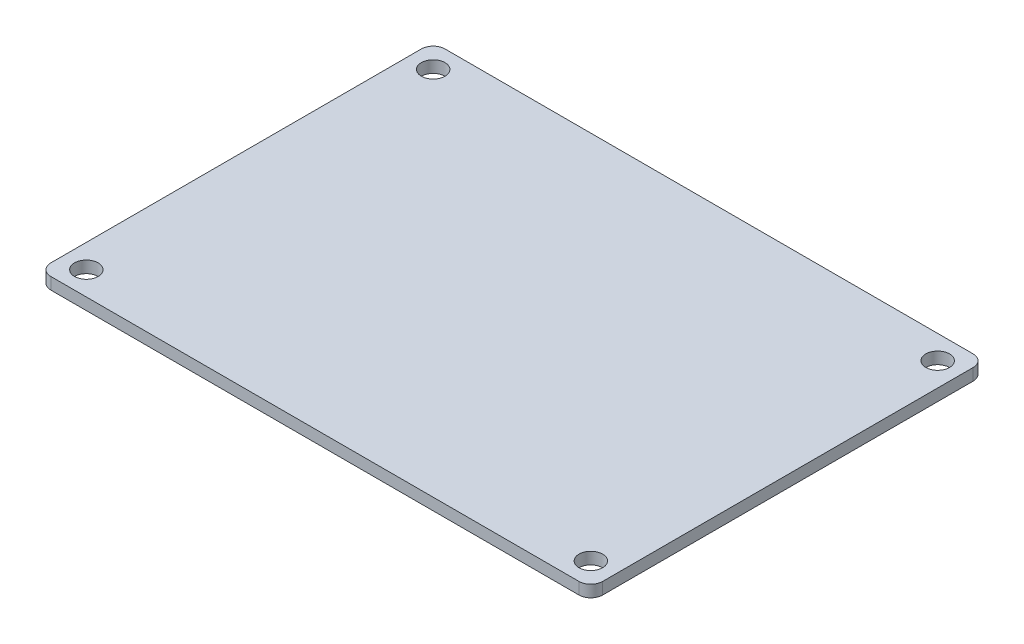
ISO-10303-21;
HEADER;
FILE_DESCRIPTION(('STEP AP214'),'2;1');
FILE_NAME('part.step','',(''),(''),'','','');
FILE_SCHEMA(('AUTOMOTIVE_DESIGN { 1 0 10303 214 1 1 1 1 }'));
ENDSEC;
DATA;
#1=APPLICATION_CONTEXT('core data for automotive mechanical design processes');
#2=APPLICATION_PROTOCOL_DEFINITION('international standard','automotive_design',2000,#1);
#3=PRODUCT_CONTEXT('',#1,'mechanical');
#4=PRODUCT('Part','Part','',(#3));
#5=PRODUCT_RELATED_PRODUCT_CATEGORY('part','',(#4));
#6=PRODUCT_DEFINITION_FORMATION('','',#4);
#7=PRODUCT_DEFINITION_CONTEXT('part definition',#1,'design');
#8=PRODUCT_DEFINITION('design','',#6,#7);
#9=PRODUCT_DEFINITION_SHAPE('','',#8);
#10=(LENGTH_UNIT() NAMED_UNIT(*) SI_UNIT(.MILLI.,.METRE.));
#11=(NAMED_UNIT(*) PLANE_ANGLE_UNIT() SI_UNIT($,.RADIAN.));
#12=(NAMED_UNIT(*) SI_UNIT($,.STERADIAN.) SOLID_ANGLE_UNIT());
#13=UNCERTAINTY_MEASURE_WITH_UNIT(LENGTH_MEASURE(1.E-05),#10,'distance_accuracy_value','');
#14=(GEOMETRIC_REPRESENTATION_CONTEXT(3) GLOBAL_UNCERTAINTY_ASSIGNED_CONTEXT((#13)) GLOBAL_UNIT_ASSIGNED_CONTEXT((#10,
#11,#12)) REPRESENTATION_CONTEXT('',''));
#15=CARTESIAN_POINT('',(0.,0.,0.));
#16=DIRECTION('',(0.,0.,1.));
#17=DIRECTION('',(1.,0.,0.));
#18=AXIS2_PLACEMENT_3D('',#15,#16,#17);
#19=CARTESIAN_POINT('',(35.,1.5,25.));
#20=DIRECTION('',(-1.,0.,0.));
#21=DIRECTION('',(0.,0.,1.));
#22=AXIS2_PLACEMENT_3D('',#19,#20,#21);
#23=PLANE('',#22);
#24=DIRECTION('',(0.,0.,-1.));
#25=VECTOR('',#24,1.);
#26=CARTESIAN_POINT('',(35.,0.,25.));
#27=LINE('',#26,#25);
#28=CARTESIAN_POINT('',(35.,0.,23.5));
#29=VERTEX_POINT('',#28);
#30=CARTESIAN_POINT('',(35.,0.,-23.5));
#31=VERTEX_POINT('',#30);
#32=EDGE_CURVE('E139',#29,#31,#27,.T.);
#33=ORIENTED_EDGE('',*,*,#32,.T.);
#34=DIRECTION('',(0.,-1.,0.));
#35=VECTOR('',#34,1.);
#36=CARTESIAN_POINT('',(35.,1.5,-23.5));
#37=LINE('',#36,#35);
#38=CARTESIAN_POINT('',(35.,1.5,-23.5));
#39=VERTEX_POINT('',#38);
#40=EDGE_CURVE('E190',#31,#39,#37,.F.);
#41=ORIENTED_EDGE('',*,*,#40,.T.);
#42=DIRECTION('',(0.,0.,-1.));
#43=VECTOR('',#42,1.);
#44=CARTESIAN_POINT('',(35.,1.5,25.));
#45=LINE('',#44,#43);
#46=CARTESIAN_POINT('',(35.,1.5,23.5));
#47=VERTEX_POINT('',#46);
#48=EDGE_CURVE('E137',#47,#39,#45,.T.);
#49=ORIENTED_EDGE('',*,*,#48,.F.);
#50=DIRECTION('',(0.,-1.,0.));
#51=VECTOR('',#50,1.);
#52=CARTESIAN_POINT('',(35.,1.5,23.5));
#53=LINE('',#52,#51);
#54=EDGE_CURVE('E186',#47,#29,#53,.T.);
#55=ORIENTED_EDGE('',*,*,#54,.T.);
#56=EDGE_LOOP('',(#33,#41,#49,#55));
#57=FACE_BOUND('',#56,.T.);
#58=ADVANCED_FACE('F38',(#57),#23,.F.);
#59=CARTESIAN_POINT('',(-35.,1.5,-25.));
#60=DIRECTION('',(0.,0.,1.));
#61=DIRECTION('',(1.,0.,0.));
#62=AXIS2_PLACEMENT_3D('',#59,#60,#61);
#63=PLANE('',#62);
#64=DIRECTION('',(-1.,0.,0.));
#65=VECTOR('',#64,1.);
#66=CARTESIAN_POINT('',(-35.,0.,-25.));
#67=LINE('',#66,#65);
#68=CARTESIAN_POINT('',(33.5,0.,-25.));
#69=VERTEX_POINT('',#68);
#70=CARTESIAN_POINT('',(-33.5,0.,-25.));
#71=VERTEX_POINT('',#70);
#72=EDGE_CURVE('E133',#69,#71,#67,.T.);
#73=ORIENTED_EDGE('',*,*,#72,.T.);
#74=DIRECTION('',(0.,-1.,0.));
#75=VECTOR('',#74,1.);
#76=CARTESIAN_POINT('',(-33.5,1.5,-25.));
#77=LINE('',#76,#75);
#78=CARTESIAN_POINT('',(-33.5,1.5,-25.));
#79=VERTEX_POINT('',#78);
#80=EDGE_CURVE('E109',#71,#79,#77,.F.);
#81=ORIENTED_EDGE('',*,*,#80,.T.);
#82=DIRECTION('',(-1.,0.,0.));
#83=VECTOR('',#82,1.);
#84=CARTESIAN_POINT('',(-35.,1.5,-25.));
#85=LINE('',#84,#83);
#86=CARTESIAN_POINT('',(33.5,1.5,-25.));
#87=VERTEX_POINT('',#86);
#88=EDGE_CURVE('E209',#87,#79,#85,.T.);
#89=ORIENTED_EDGE('',*,*,#88,.F.);
#90=DIRECTION('',(0.,-1.,0.));
#91=VECTOR('',#90,1.);
#92=CARTESIAN_POINT('',(33.5,1.5,-25.));
#93=LINE('',#92,#91);
#94=EDGE_CURVE('E115',#87,#69,#93,.T.);
#95=ORIENTED_EDGE('',*,*,#94,.T.);
#96=EDGE_LOOP('',(#73,#81,#89,#95));
#97=FACE_BOUND('',#96,.T.);
#98=ADVANCED_FACE('F250',(#97),#63,.F.);
#99=CARTESIAN_POINT('',(-35.,1.5,25.));
#100=DIRECTION('',(1.,0.,0.));
#101=DIRECTION('',(0.,0.,-1.));
#102=AXIS2_PLACEMENT_3D('',#99,#100,#101);
#103=PLANE('',#102);
#104=DIRECTION('',(0.,0.,1.));
#105=VECTOR('',#104,1.);
#106=CARTESIAN_POINT('',(-35.,1.5,25.));
#107=LINE('',#106,#105);
#108=CARTESIAN_POINT('',(-35.,1.5,-23.5));
#109=VERTEX_POINT('',#108);
#110=CARTESIAN_POINT('',(-35.,1.5,23.5));
#111=VERTEX_POINT('',#110);
#112=EDGE_CURVE('E124',#109,#111,#107,.T.);
#113=ORIENTED_EDGE('',*,*,#112,.F.);
#114=DIRECTION('',(0.,-1.,0.));
#115=VECTOR('',#114,1.);
#116=CARTESIAN_POINT('',(-35.,1.5,-23.5));
#117=LINE('',#116,#115);
#118=CARTESIAN_POINT('',(-35.,0.,-23.5));
#119=VERTEX_POINT('',#118);
#120=EDGE_CURVE('E108',#109,#119,#117,.T.);
#121=ORIENTED_EDGE('',*,*,#120,.T.);
#122=DIRECTION('',(0.,0.,1.));
#123=VECTOR('',#122,1.);
#124=CARTESIAN_POINT('',(-35.,0.,25.));
#125=LINE('',#124,#123);
#126=CARTESIAN_POINT('',(-35.,0.,23.5));
#127=VERTEX_POINT('',#126);
#128=EDGE_CURVE('E122',#119,#127,#125,.T.);
#129=ORIENTED_EDGE('',*,*,#128,.T.);
#130=DIRECTION('',(0.,-1.,0.));
#131=VECTOR('',#130,1.);
#132=CARTESIAN_POINT('',(-35.,1.5,23.5));
#133=LINE('',#132,#131);
#134=EDGE_CURVE('E127',#127,#111,#133,.F.);
#135=ORIENTED_EDGE('',*,*,#134,.T.);
#136=EDGE_LOOP('',(#113,#121,#129,#135));
#137=FACE_BOUND('',#136,.T.);
#138=ADVANCED_FACE('F121',(#137),#103,.F.);
#139=CARTESIAN_POINT('',(-35.,1.5,25.));
#140=DIRECTION('',(0.,0.,-1.));
#141=DIRECTION('',(-1.,0.,0.));
#142=AXIS2_PLACEMENT_3D('',#139,#140,#141);
#143=PLANE('',#142);
#144=DIRECTION('',(1.,0.,0.));
#145=VECTOR('',#144,1.);
#146=CARTESIAN_POINT('',(-35.,0.,25.));
#147=LINE('',#146,#145);
#148=CARTESIAN_POINT('',(-33.5,0.,25.));
#149=VERTEX_POINT('',#148);
#150=CARTESIAN_POINT('',(33.5,0.,25.));
#151=VERTEX_POINT('',#150);
#152=EDGE_CURVE('E132',#149,#151,#147,.T.);
#153=ORIENTED_EDGE('',*,*,#152,.T.);
#154=DIRECTION('',(0.,-1.,0.));
#155=VECTOR('',#154,1.);
#156=CARTESIAN_POINT('',(33.5,1.5,25.));
#157=LINE('',#156,#155);
#158=CARTESIAN_POINT('',(33.5,1.5,25.));
#159=VERTEX_POINT('',#158);
#160=EDGE_CURVE('E11',#151,#159,#157,.F.);
#161=ORIENTED_EDGE('',*,*,#160,.T.);
#162=DIRECTION('',(1.,0.,0.));
#163=VECTOR('',#162,1.);
#164=CARTESIAN_POINT('',(-35.,1.5,25.));
#165=LINE('',#164,#163);
#166=CARTESIAN_POINT('',(-33.5,1.5,25.));
#167=VERTEX_POINT('',#166);
#168=EDGE_CURVE('E161',#167,#159,#165,.T.);
#169=ORIENTED_EDGE('',*,*,#168,.F.);
#170=DIRECTION('',(0.,-1.,0.));
#171=VECTOR('',#170,1.);
#172=CARTESIAN_POINT('',(-33.5,1.5,25.));
#173=LINE('',#172,#171);
#174=EDGE_CURVE('E47',#167,#149,#173,.T.);
#175=ORIENTED_EDGE('',*,*,#174,.T.);
#176=EDGE_LOOP('',(#153,#161,#169,#175));
#177=FACE_BOUND('',#176,.T.);
#178=ADVANCED_FACE('F195',(#177),#143,.F.);
#179=CARTESIAN_POINT('',(0.,1.5,0.));
#180=DIRECTION('',(0.,-1.,0.));
#181=DIRECTION('',(0.,0.,-1.));
#182=AXIS2_PLACEMENT_3D('',#179,#180,#181);
#183=PLANE('',#182);
#184=CARTESIAN_POINT('',(-32.0000000000002,1.5,-22.));
#185=DIRECTION('',(0.,1.,0.));
#186=DIRECTION('',(0.,0.,1.));
#187=AXIS2_PLACEMENT_3D('',#184,#185,#186);
#188=CIRCLE('',#187,1.5);
#189=CARTESIAN_POINT('',(-32.0000000000002,1.5,-20.5));
#190=VERTEX_POINT('',#189);
#191=EDGE_CURVE('E231',#190,#190,#188,.T.);
#192=ORIENTED_EDGE('',*,*,#191,.F.);
#193=EDGE_LOOP('',(#192));
#194=FACE_BOUND('',#193,.T.);
#195=CARTESIAN_POINT('',(31.9999999999998,1.5,-22.));
#196=DIRECTION('',(0.,1.,0.));
#197=DIRECTION('',(0.,0.,1.));
#198=AXIS2_PLACEMENT_3D('',#195,#196,#197);
#199=CIRCLE('',#198,1.5);
#200=CARTESIAN_POINT('',(31.9999999999998,1.5,-20.5));
#201=VERTEX_POINT('',#200);
#202=EDGE_CURVE('E227',#201,#201,#199,.T.);
#203=ORIENTED_EDGE('',*,*,#202,.F.);
#204=EDGE_LOOP('',(#203));
#205=FACE_BOUND('',#204,.T.);
#206=CARTESIAN_POINT('',(32.,1.5,22.));
#207=DIRECTION('',(0.,1.,0.));
#208=DIRECTION('',(0.,0.,1.));
#209=AXIS2_PLACEMENT_3D('',#206,#207,#208);
#210=CIRCLE('',#209,1.5);
#211=CARTESIAN_POINT('',(32.,1.5,23.5));
#212=VERTEX_POINT('',#211);
#213=EDGE_CURVE('E224',#212,#212,#210,.T.);
#214=ORIENTED_EDGE('',*,*,#213,.F.);
#215=EDGE_LOOP('',(#214));
#216=FACE_BOUND('',#215,.T.);
#217=CARTESIAN_POINT('',(-32.,1.5,22.));
#218=DIRECTION('',(0.,1.,0.));
#219=DIRECTION('',(0.,0.,1.));
#220=AXIS2_PLACEMENT_3D('',#217,#218,#219);
#221=CIRCLE('',#220,1.5);
#222=CARTESIAN_POINT('',(-32.,1.5,23.5));
#223=VERTEX_POINT('',#222);
#224=EDGE_CURVE('E148',#223,#223,#221,.T.);
#225=ORIENTED_EDGE('',*,*,#224,.F.);
#226=EDGE_LOOP('',(#225));
#227=FACE_BOUND('',#226,.T.);
#228=ORIENTED_EDGE('',*,*,#88,.T.);
#229=CARTESIAN_POINT('',(-33.5,1.5,-23.5));
#230=DIRECTION('',(0.,-1.,0.));
#231=DIRECTION('',(0.,0.,-1.));
#232=AXIS2_PLACEMENT_3D('',#229,#230,#231);
#233=CIRCLE('',#232,1.5);
#234=EDGE_CURVE('E183',#79,#109,#233,.F.);
#235=ORIENTED_EDGE('',*,*,#234,.T.);
#236=ORIENTED_EDGE('',*,*,#112,.T.);
#237=CARTESIAN_POINT('',(-33.5,1.5,23.5));
#238=DIRECTION('',(0.,-1.,0.));
#239=DIRECTION('',(0.,0.,-1.));
#240=AXIS2_PLACEMENT_3D('',#237,#238,#239);
#241=CIRCLE('',#240,1.5);
#242=EDGE_CURVE('E59',#111,#167,#241,.F.);
#243=ORIENTED_EDGE('',*,*,#242,.T.);
#244=ORIENTED_EDGE('',*,*,#168,.T.);
#245=CARTESIAN_POINT('',(33.5,1.5,23.5));
#246=DIRECTION('',(0.,-1.,0.));
#247=DIRECTION('',(0.,0.,-1.));
#248=AXIS2_PLACEMENT_3D('',#245,#246,#247);
#249=CIRCLE('',#248,1.5);
#250=EDGE_CURVE('E177',#159,#47,#249,.F.);
#251=ORIENTED_EDGE('',*,*,#250,.T.);
#252=ORIENTED_EDGE('',*,*,#48,.T.);
#253=CARTESIAN_POINT('',(33.5,1.5,-23.5));
#254=DIRECTION('',(0.,-1.,0.));
#255=DIRECTION('',(0.,0.,-1.));
#256=AXIS2_PLACEMENT_3D('',#253,#254,#255);
#257=CIRCLE('',#256,1.5);
#258=EDGE_CURVE('E180',#39,#87,#257,.F.);
#259=ORIENTED_EDGE('',*,*,#258,.T.);
#260=EDGE_LOOP('',(#228,#235,#236,#243,#244,#251,#252,#259));
#261=FACE_BOUND('',#260,.T.);
#262=ADVANCED_FACE('F238',(#194,#205,#216,#227,#261),#183,.F.);
#263=CARTESIAN_POINT('',(0.,0.,0.));
#264=DIRECTION('',(0.,-1.,0.));
#265=DIRECTION('',(0.,0.,-1.));
#266=AXIS2_PLACEMENT_3D('',#263,#264,#265);
#267=PLANE('',#266);
#268=CARTESIAN_POINT('',(-32.0000000000002,0.,-22.));
#269=DIRECTION('',(0.,-1.,0.));
#270=DIRECTION('',(0.,0.,-1.));
#271=AXIS2_PLACEMENT_3D('',#268,#269,#270);
#272=CIRCLE('',#271,1.5);
#273=CARTESIAN_POINT('',(-32.0000000000002,0.,-23.5));
#274=VERTEX_POINT('',#273);
#275=EDGE_CURVE('E156',#274,#274,#272,.T.);
#276=ORIENTED_EDGE('',*,*,#275,.F.);
#277=EDGE_LOOP('',(#276));
#278=FACE_BOUND('',#277,.T.);
#279=CARTESIAN_POINT('',(31.9999999999998,0.,-22.));
#280=DIRECTION('',(0.,-1.,0.));
#281=DIRECTION('',(0.,0.,-1.));
#282=AXIS2_PLACEMENT_3D('',#279,#280,#281);
#283=CIRCLE('',#282,1.5);
#284=CARTESIAN_POINT('',(31.9999999999998,0.,-23.5));
#285=VERTEX_POINT('',#284);
#286=EDGE_CURVE('E152',#285,#285,#283,.T.);
#287=ORIENTED_EDGE('',*,*,#286,.F.);
#288=EDGE_LOOP('',(#287));
#289=FACE_BOUND('',#288,.T.);
#290=CARTESIAN_POINT('',(32.,0.,22.));
#291=DIRECTION('',(0.,-1.,0.));
#292=DIRECTION('',(0.,0.,-1.));
#293=AXIS2_PLACEMENT_3D('',#290,#291,#292);
#294=CIRCLE('',#293,1.5);
#295=CARTESIAN_POINT('',(32.,0.,20.5));
#296=VERTEX_POINT('',#295);
#297=EDGE_CURVE('E147',#296,#296,#294,.T.);
#298=ORIENTED_EDGE('',*,*,#297,.F.);
#299=EDGE_LOOP('',(#298));
#300=FACE_BOUND('',#299,.T.);
#301=CARTESIAN_POINT('',(-32.,0.,22.));
#302=DIRECTION('',(0.,-1.,0.));
#303=DIRECTION('',(0.,0.,-1.));
#304=AXIS2_PLACEMENT_3D('',#301,#302,#303);
#305=CIRCLE('',#304,1.5);
#306=CARTESIAN_POINT('',(-32.,0.,20.5));
#307=VERTEX_POINT('',#306);
#308=EDGE_CURVE('E143',#307,#307,#305,.T.);
#309=ORIENTED_EDGE('',*,*,#308,.F.);
#310=EDGE_LOOP('',(#309));
#311=FACE_BOUND('',#310,.T.);
#312=ORIENTED_EDGE('',*,*,#128,.F.);
#313=CARTESIAN_POINT('',(-33.5,0.,-23.5));
#314=DIRECTION('',(0.,-1.,0.));
#315=DIRECTION('',(0.,0.,-1.));
#316=AXIS2_PLACEMENT_3D('',#313,#314,#315);
#317=CIRCLE('',#316,1.5);
#318=EDGE_CURVE('E104',#119,#71,#317,.T.);
#319=ORIENTED_EDGE('',*,*,#318,.T.);
#320=ORIENTED_EDGE('',*,*,#72,.F.);
#321=CARTESIAN_POINT('',(33.5,0.,-23.5));
#322=DIRECTION('',(0.,-1.,0.));
#323=DIRECTION('',(0.,0.,-1.));
#324=AXIS2_PLACEMENT_3D('',#321,#322,#323);
#325=CIRCLE('',#324,1.5);
#326=EDGE_CURVE('E116',#69,#31,#325,.T.);
#327=ORIENTED_EDGE('',*,*,#326,.T.);
#328=ORIENTED_EDGE('',*,*,#32,.F.);
#329=CARTESIAN_POINT('',(33.5,0.,23.5));
#330=DIRECTION('',(0.,-1.,0.));
#331=DIRECTION('',(0.,0.,-1.));
#332=AXIS2_PLACEMENT_3D('',#329,#330,#331);
#333=CIRCLE('',#332,1.5);
#334=EDGE_CURVE('E165',#29,#151,#333,.T.);
#335=ORIENTED_EDGE('',*,*,#334,.T.);
#336=ORIENTED_EDGE('',*,*,#152,.F.);
#337=CARTESIAN_POINT('',(-33.5,0.,23.5));
#338=DIRECTION('',(0.,-1.,0.));
#339=DIRECTION('',(0.,0.,-1.));
#340=AXIS2_PLACEMENT_3D('',#337,#338,#339);
#341=CIRCLE('',#340,1.5);
#342=EDGE_CURVE('E126',#149,#127,#341,.T.);
#343=ORIENTED_EDGE('',*,*,#342,.T.);
#344=EDGE_LOOP('',(#312,#319,#320,#327,#328,#335,#336,#343));
#345=FACE_BOUND('',#344,.T.);
#346=ADVANCED_FACE('F129',(#278,#289,#300,#311,#345),#267,.T.);
#347=CARTESIAN_POINT('',(-32.,-8.5,22.));
#348=DIRECTION('',(0.,1.,0.));
#349=DIRECTION('',(0.,0.,1.));
#350=AXIS2_PLACEMENT_3D('',#347,#348,#349);
#351=CYLINDRICAL_SURFACE('',#350,1.5);
#352=ORIENTED_EDGE('',*,*,#308,.T.);
#353=EDGE_LOOP('',(#352));
#354=FACE_BOUND('',#353,.T.);
#355=ORIENTED_EDGE('',*,*,#224,.T.);
#356=EDGE_LOOP('',(#355));
#357=FACE_BOUND('',#356,.T.);
#358=ADVANCED_FACE('F273',(#354,#357),#351,.F.);
#359=CARTESIAN_POINT('',(32.,-8.5,22.));
#360=DIRECTION('',(0.,1.,0.));
#361=DIRECTION('',(0.,0.,1.));
#362=AXIS2_PLACEMENT_3D('',#359,#360,#361);
#363=CYLINDRICAL_SURFACE('',#362,1.5);
#364=ORIENTED_EDGE('',*,*,#297,.T.);
#365=EDGE_LOOP('',(#364));
#366=FACE_BOUND('',#365,.T.);
#367=ORIENTED_EDGE('',*,*,#213,.T.);
#368=EDGE_LOOP('',(#367));
#369=FACE_BOUND('',#368,.T.);
#370=ADVANCED_FACE('F278',(#366,#369),#363,.F.);
#371=CARTESIAN_POINT('',(31.9999999999998,-8.5,-22.));
#372=DIRECTION('',(0.,1.,0.));
#373=DIRECTION('',(0.,0.,1.));
#374=AXIS2_PLACEMENT_3D('',#371,#372,#373);
#375=CYLINDRICAL_SURFACE('',#374,1.5);
#376=ORIENTED_EDGE('',*,*,#286,.T.);
#377=EDGE_LOOP('',(#376));
#378=FACE_BOUND('',#377,.T.);
#379=ORIENTED_EDGE('',*,*,#202,.T.);
#380=EDGE_LOOP('',(#379));
#381=FACE_BOUND('',#380,.T.);
#382=ADVANCED_FACE('F282',(#378,#381),#375,.F.);
#383=CARTESIAN_POINT('',(-32.0000000000002,-8.5,-22.));
#384=DIRECTION('',(0.,1.,0.));
#385=DIRECTION('',(0.,0.,1.));
#386=AXIS2_PLACEMENT_3D('',#383,#384,#385);
#387=CYLINDRICAL_SURFACE('',#386,1.5);
#388=ORIENTED_EDGE('',*,*,#275,.T.);
#389=EDGE_LOOP('',(#388));
#390=FACE_BOUND('',#389,.T.);
#391=ORIENTED_EDGE('',*,*,#191,.T.);
#392=EDGE_LOOP('',(#391));
#393=FACE_BOUND('',#392,.T.);
#394=ADVANCED_FACE('F236',(#390,#393),#387,.F.);
#395=CARTESIAN_POINT('',(-33.5,1.5,-23.5));
#396=DIRECTION('',(0.,-1.,0.));
#397=DIRECTION('',(0.,0.,-1.));
#398=AXIS2_PLACEMENT_3D('',#395,#396,#397);
#399=CYLINDRICAL_SURFACE('',#398,1.5);
#400=ORIENTED_EDGE('',*,*,#234,.F.);
#401=ORIENTED_EDGE('',*,*,#80,.F.);
#402=ORIENTED_EDGE('',*,*,#318,.F.);
#403=ORIENTED_EDGE('',*,*,#120,.F.);
#404=EDGE_LOOP('',(#400,#401,#402,#403));
#405=FACE_BOUND('',#404,.T.);
#406=ADVANCED_FACE('F107',(#405),#399,.T.);
#407=CARTESIAN_POINT('',(33.5,1.5,-23.5));
#408=DIRECTION('',(0.,-1.,0.));
#409=DIRECTION('',(0.,0.,-1.));
#410=AXIS2_PLACEMENT_3D('',#407,#408,#409);
#411=CYLINDRICAL_SURFACE('',#410,1.5);
#412=ORIENTED_EDGE('',*,*,#258,.F.);
#413=ORIENTED_EDGE('',*,*,#40,.F.);
#414=ORIENTED_EDGE('',*,*,#326,.F.);
#415=ORIENTED_EDGE('',*,*,#94,.F.);
#416=EDGE_LOOP('',(#412,#413,#414,#415));
#417=FACE_BOUND('',#416,.T.);
#418=ADVANCED_FACE('F252',(#417),#411,.T.);
#419=CARTESIAN_POINT('',(33.5,1.5,23.5));
#420=DIRECTION('',(0.,-1.,0.));
#421=DIRECTION('',(0.,0.,-1.));
#422=AXIS2_PLACEMENT_3D('',#419,#420,#421);
#423=CYLINDRICAL_SURFACE('',#422,1.5);
#424=ORIENTED_EDGE('',*,*,#250,.F.);
#425=ORIENTED_EDGE('',*,*,#160,.F.);
#426=ORIENTED_EDGE('',*,*,#334,.F.);
#427=ORIENTED_EDGE('',*,*,#54,.F.);
#428=EDGE_LOOP('',(#424,#425,#426,#427));
#429=FACE_BOUND('',#428,.T.);
#430=ADVANCED_FACE('F202',(#429),#423,.T.);
#431=CARTESIAN_POINT('',(-33.5,1.5,23.5));
#432=DIRECTION('',(0.,-1.,0.));
#433=DIRECTION('',(0.,0.,-1.));
#434=AXIS2_PLACEMENT_3D('',#431,#432,#433);
#435=CYLINDRICAL_SURFACE('',#434,1.5);
#436=ORIENTED_EDGE('',*,*,#242,.F.);
#437=ORIENTED_EDGE('',*,*,#134,.F.);
#438=ORIENTED_EDGE('',*,*,#342,.F.);
#439=ORIENTED_EDGE('',*,*,#174,.F.);
#440=EDGE_LOOP('',(#436,#437,#438,#439));
#441=FACE_BOUND('',#440,.T.);
#442=ADVANCED_FACE('F40',(#441),#435,.T.);
#443=CLOSED_SHELL('',(#58,#98,#138,#178,#262,#346,#358,#370,#382,#394,#406,#418,#430,#442));
#444=MANIFOLD_SOLID_BREP('B2',#443);
#445=ADVANCED_BREP_SHAPE_REPRESENTATION('',(#18,#444),#14);
#446=SHAPE_DEFINITION_REPRESENTATION(#9,#445);
ENDSEC;
END-ISO-10303-21;
